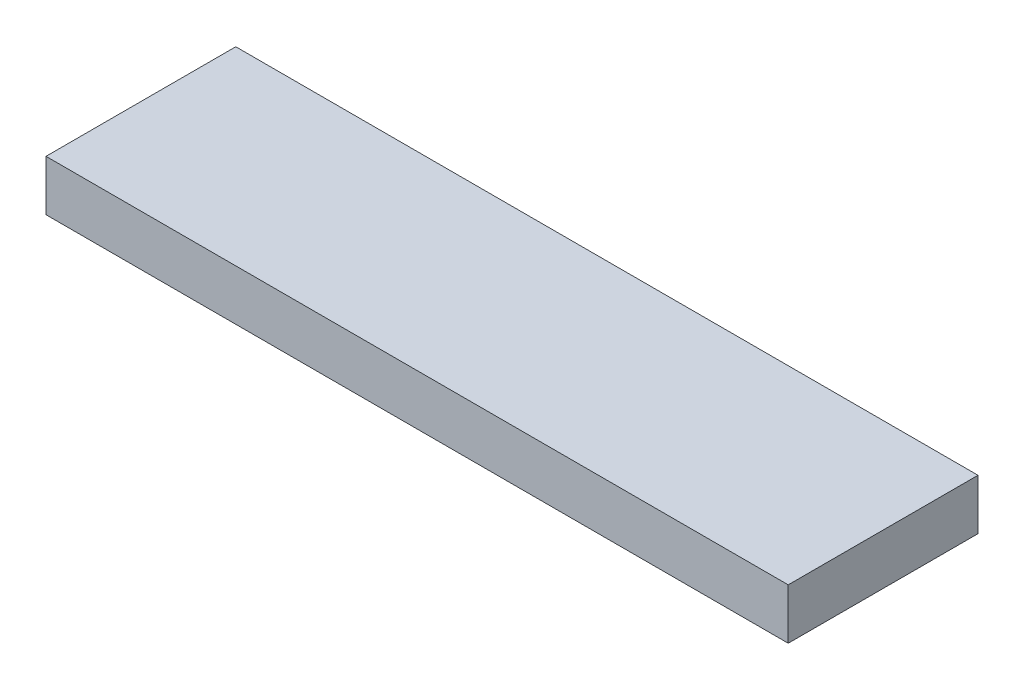
ISO-10303-21;
HEADER;
FILE_DESCRIPTION(('STEP AP214'),'2;1');
FILE_NAME('part.step','',(''),(''),'','','');
FILE_SCHEMA(('AUTOMOTIVE_DESIGN { 1 0 10303 214 1 1 1 1 }'));
ENDSEC;
DATA;
#1=APPLICATION_CONTEXT('core data for automotive mechanical design processes');
#2=APPLICATION_PROTOCOL_DEFINITION('international standard','automotive_design',2000,#1);
#3=PRODUCT_CONTEXT('',#1,'mechanical');
#4=PRODUCT('Part','Part','',(#3));
#5=PRODUCT_RELATED_PRODUCT_CATEGORY('part','',(#4));
#6=PRODUCT_DEFINITION_FORMATION('','',#4);
#7=PRODUCT_DEFINITION_CONTEXT('part definition',#1,'design');
#8=PRODUCT_DEFINITION('design','',#6,#7);
#9=PRODUCT_DEFINITION_SHAPE('','',#8);
#10=(LENGTH_UNIT() NAMED_UNIT(*) SI_UNIT(.MILLI.,.METRE.));
#11=(NAMED_UNIT(*) PLANE_ANGLE_UNIT() SI_UNIT($,.RADIAN.));
#12=(NAMED_UNIT(*) SI_UNIT($,.STERADIAN.) SOLID_ANGLE_UNIT());
#13=UNCERTAINTY_MEASURE_WITH_UNIT(LENGTH_MEASURE(1.E-05),#10,'distance_accuracy_value','');
#14=(GEOMETRIC_REPRESENTATION_CONTEXT(3) GLOBAL_UNCERTAINTY_ASSIGNED_CONTEXT((#13)) GLOBAL_UNIT_ASSIGNED_CONTEXT((#10,
#11,#12)) REPRESENTATION_CONTEXT('',''));
#15=CARTESIAN_POINT('',(0.,0.,0.));
#16=DIRECTION('',(0.,0.,1.));
#17=DIRECTION('',(1.,0.,0.));
#18=AXIS2_PLACEMENT_3D('',#15,#16,#17);
#19=CARTESIAN_POINT('',(44.,6.,22.5));
#20=DIRECTION('',(-1.,0.,0.));
#21=DIRECTION('',(0.,0.,-1.));
#22=AXIS2_PLACEMENT_3D('',#19,#20,#21);
#23=PLANE('',#22);
#24=DIRECTION('',(0.,0.,1.));
#25=VECTOR('',#24,1.);
#26=CARTESIAN_POINT('',(44.,0.,22.5));
#27=LINE('',#26,#25);
#28=CARTESIAN_POINT('',(44.,0.,0.));
#29=VERTEX_POINT('',#28);
#30=CARTESIAN_POINT('',(44.,0.,22.5));
#31=VERTEX_POINT('',#30);
#32=EDGE_CURVE('E98',#29,#31,#27,.T.);
#33=ORIENTED_EDGE('',*,*,#32,.F.);
#34=DIRECTION('',(0.,-1.,0.));
#35=VECTOR('',#34,1.);
#36=CARTESIAN_POINT('',(44.,6.,0.));
#37=LINE('',#36,#35);
#38=CARTESIAN_POINT('',(44.,6.,0.));
#39=VERTEX_POINT('',#38);
#40=EDGE_CURVE('E97',#39,#29,#37,.T.);
#41=ORIENTED_EDGE('',*,*,#40,.F.);
#42=DIRECTION('',(0.,0.,1.));
#43=VECTOR('',#42,1.);
#44=CARTESIAN_POINT('',(44.,6.,22.5));
#45=LINE('',#44,#43);
#46=CARTESIAN_POINT('',(44.,6.,22.5));
#47=VERTEX_POINT('',#46);
#48=EDGE_CURVE('E92',#39,#47,#45,.T.);
#49=ORIENTED_EDGE('',*,*,#48,.T.);
#50=DIRECTION('',(0.,-1.,0.));
#51=VECTOR('',#50,1.);
#52=CARTESIAN_POINT('',(44.,6.,22.5));
#53=LINE('',#52,#51);
#54=EDGE_CURVE('E11',#47,#31,#53,.T.);
#55=ORIENTED_EDGE('',*,*,#54,.T.);
#56=EDGE_LOOP('',(#33,#41,#49,#55));
#57=FACE_BOUND('',#56,.T.);
#58=ADVANCED_FACE('F35',(#57),#23,.F.);
#59=CARTESIAN_POINT('',(-44.,6.,22.5));
#60=DIRECTION('',(0.,0.,-1.));
#61=DIRECTION('',(1.,0.,0.));
#62=AXIS2_PLACEMENT_3D('',#59,#60,#61);
#63=PLANE('',#62);
#64=DIRECTION('',(-1.,0.,0.));
#65=VECTOR('',#64,1.);
#66=CARTESIAN_POINT('',(-44.,0.,22.5));
#67=LINE('',#66,#65);
#68=CARTESIAN_POINT('',(-44.,0.,22.5));
#69=VERTEX_POINT('',#68);
#70=EDGE_CURVE('E100',#31,#69,#67,.T.);
#71=ORIENTED_EDGE('',*,*,#70,.F.);
#72=ORIENTED_EDGE('',*,*,#54,.F.);
#73=DIRECTION('',(-1.,0.,0.));
#74=VECTOR('',#73,1.);
#75=CARTESIAN_POINT('',(-44.,6.,22.5));
#76=LINE('',#75,#74);
#77=CARTESIAN_POINT('',(-44.,6.,22.5));
#78=VERTEX_POINT('',#77);
#79=EDGE_CURVE('E76',#47,#78,#76,.T.);
#80=ORIENTED_EDGE('',*,*,#79,.T.);
#81=DIRECTION('',(0.,-1.,0.));
#82=VECTOR('',#81,1.);
#83=CARTESIAN_POINT('',(-44.,6.,22.5));
#84=LINE('',#83,#82);
#85=EDGE_CURVE('E43',#78,#69,#84,.T.);
#86=ORIENTED_EDGE('',*,*,#85,.T.);
#87=EDGE_LOOP('',(#71,#72,#80,#86));
#88=FACE_BOUND('',#87,.T.);
#89=ADVANCED_FACE('F90',(#88),#63,.F.);
#90=CARTESIAN_POINT('',(-44.,6.,22.5));
#91=DIRECTION('',(1.,0.,0.));
#92=DIRECTION('',(0.,0.,1.));
#93=AXIS2_PLACEMENT_3D('',#90,#91,#92);
#94=PLANE('',#93);
#95=DIRECTION('',(0.,0.,-1.));
#96=VECTOR('',#95,1.);
#97=CARTESIAN_POINT('',(-44.,0.,22.5));
#98=LINE('',#97,#96);
#99=CARTESIAN_POINT('',(-44.,0.,0.));
#100=VERTEX_POINT('',#99);
#101=EDGE_CURVE('E86',#69,#100,#98,.T.);
#102=ORIENTED_EDGE('',*,*,#101,.F.);
#103=ORIENTED_EDGE('',*,*,#85,.F.);
#104=DIRECTION('',(0.,0.,-1.));
#105=VECTOR('',#104,1.);
#106=CARTESIAN_POINT('',(-44.,6.,22.5));
#107=LINE('',#106,#105);
#108=CARTESIAN_POINT('',(-44.,6.,0.));
#109=VERTEX_POINT('',#108);
#110=EDGE_CURVE('E79',#78,#109,#107,.T.);
#111=ORIENTED_EDGE('',*,*,#110,.T.);
#112=DIRECTION('',(0.,-1.,0.));
#113=VECTOR('',#112,1.);
#114=CARTESIAN_POINT('',(-44.,6.,0.));
#115=LINE('',#114,#113);
#116=EDGE_CURVE('E89',#109,#100,#115,.T.);
#117=ORIENTED_EDGE('',*,*,#116,.T.);
#118=EDGE_LOOP('',(#102,#103,#111,#117));
#119=FACE_BOUND('',#118,.T.);
#120=ADVANCED_FACE('F85',(#119),#94,.F.);
#121=CARTESIAN_POINT('',(-44.,6.,0.));
#122=DIRECTION('',(0.,0.,1.));
#123=DIRECTION('',(-1.,0.,0.));
#124=AXIS2_PLACEMENT_3D('',#121,#122,#123);
#125=PLANE('',#124);
#126=DIRECTION('',(1.,0.,0.));
#127=VECTOR('',#126,1.);
#128=CARTESIAN_POINT('',(-44.,0.,0.));
#129=LINE('',#128,#127);
#130=EDGE_CURVE('E65',#100,#29,#129,.T.);
#131=ORIENTED_EDGE('',*,*,#130,.F.);
#132=ORIENTED_EDGE('',*,*,#116,.F.);
#133=DIRECTION('',(1.,0.,0.));
#134=VECTOR('',#133,1.);
#135=CARTESIAN_POINT('',(-44.,6.,0.));
#136=LINE('',#135,#134);
#137=EDGE_CURVE('E51',#109,#39,#136,.T.);
#138=ORIENTED_EDGE('',*,*,#137,.T.);
#139=ORIENTED_EDGE('',*,*,#40,.T.);
#140=EDGE_LOOP('',(#131,#132,#138,#139));
#141=FACE_BOUND('',#140,.T.);
#142=ADVANCED_FACE('F109',(#141),#125,.F.);
#143=CARTESIAN_POINT('',(0.,6.,0.));
#144=DIRECTION('',(0.,1.,0.));
#145=DIRECTION('',(0.,0.,-1.));
#146=AXIS2_PLACEMENT_3D('',#143,#144,#145);
#147=PLANE('',#146);
#148=ORIENTED_EDGE('',*,*,#48,.F.);
#149=ORIENTED_EDGE('',*,*,#137,.F.);
#150=ORIENTED_EDGE('',*,*,#110,.F.);
#151=ORIENTED_EDGE('',*,*,#79,.F.);
#152=EDGE_LOOP('',(#148,#149,#150,#151));
#153=FACE_BOUND('',#152,.T.);
#154=ADVANCED_FACE('F81',(#153),#147,.T.);
#155=CARTESIAN_POINT('',(0.,0.,0.));
#156=DIRECTION('',(0.,1.,0.));
#157=DIRECTION('',(0.,0.,-1.));
#158=AXIS2_PLACEMENT_3D('',#155,#156,#157);
#159=PLANE('',#158);
#160=ORIENTED_EDGE('',*,*,#32,.T.);
#161=ORIENTED_EDGE('',*,*,#70,.T.);
#162=ORIENTED_EDGE('',*,*,#101,.T.);
#163=ORIENTED_EDGE('',*,*,#130,.T.);
#164=EDGE_LOOP('',(#160,#161,#162,#163));
#165=FACE_BOUND('',#164,.T.);
#166=ADVANCED_FACE('F105',(#165),#159,.F.);
#167=CLOSED_SHELL('',(#58,#89,#120,#142,#154,#166));
#168=MANIFOLD_SOLID_BREP('B2',#167);
#169=ADVANCED_BREP_SHAPE_REPRESENTATION('',(#18,#168),#14);
#170=SHAPE_DEFINITION_REPRESENTATION(#9,#169);
ENDSEC;
END-ISO-10303-21;
